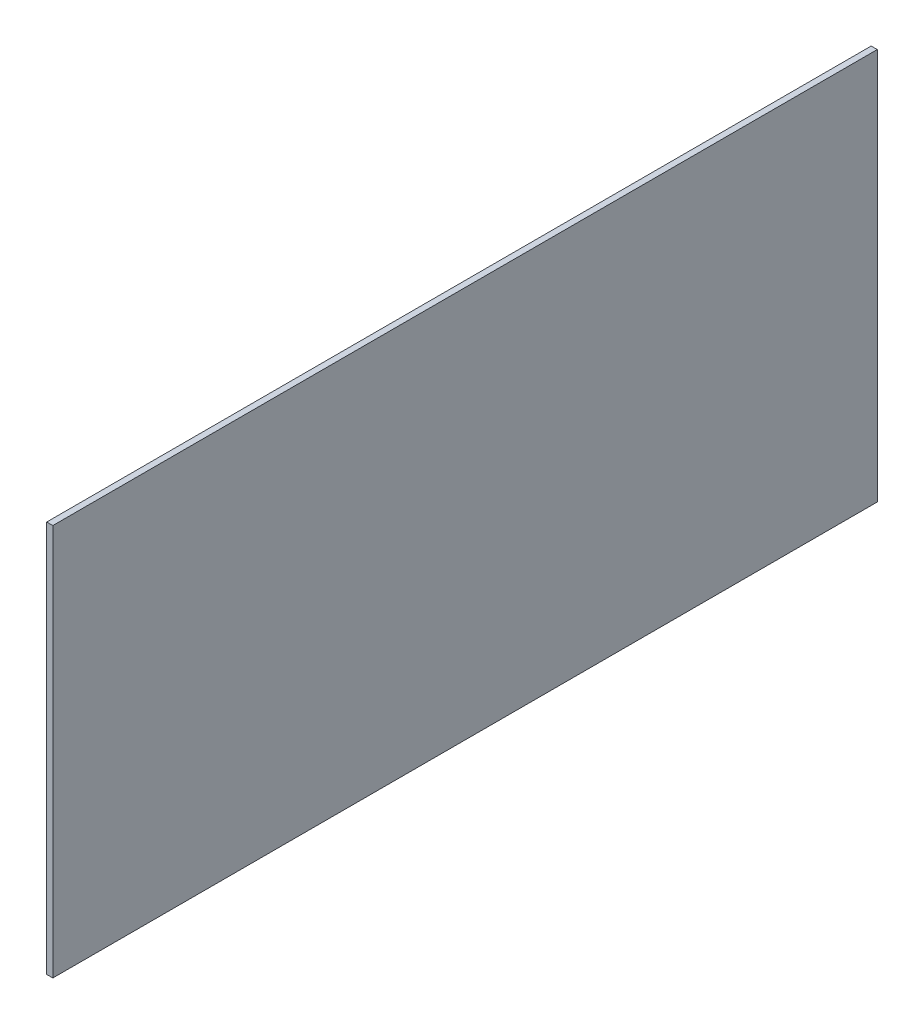
ISO-10303-21;
HEADER;
FILE_DESCRIPTION(('STEP AP214'),'2;1');
FILE_NAME('part.step','',(''),(''),'','','');
FILE_SCHEMA(('AUTOMOTIVE_DESIGN { 1 0 10303 214 1 1 1 1 }'));
ENDSEC;
DATA;
#1=APPLICATION_CONTEXT('core data for automotive mechanical design processes');
#2=APPLICATION_PROTOCOL_DEFINITION('international standard','automotive_design',2000,#1);
#3=PRODUCT_CONTEXT('',#1,'mechanical');
#4=PRODUCT('Part','Part','',(#3));
#5=PRODUCT_RELATED_PRODUCT_CATEGORY('part','',(#4));
#6=PRODUCT_DEFINITION_FORMATION('','',#4);
#7=PRODUCT_DEFINITION_CONTEXT('part definition',#1,'design');
#8=PRODUCT_DEFINITION('design','',#6,#7);
#9=PRODUCT_DEFINITION_SHAPE('','',#8);
#10=(LENGTH_UNIT() NAMED_UNIT(*) SI_UNIT(.MILLI.,.METRE.));
#11=(NAMED_UNIT(*) PLANE_ANGLE_UNIT() SI_UNIT($,.RADIAN.));
#12=(NAMED_UNIT(*) SI_UNIT($,.STERADIAN.) SOLID_ANGLE_UNIT());
#13=UNCERTAINTY_MEASURE_WITH_UNIT(LENGTH_MEASURE(1.E-05),#10,'distance_accuracy_value','');
#14=(GEOMETRIC_REPRESENTATION_CONTEXT(3) GLOBAL_UNCERTAINTY_ASSIGNED_CONTEXT((#13)) GLOBAL_UNIT_ASSIGNED_CONTEXT((#10,
#11,#12)) REPRESENTATION_CONTEXT('',''));
#15=CARTESIAN_POINT('',(0.,0.,0.));
#16=DIRECTION('',(0.,0.,1.));
#17=DIRECTION('',(1.,0.,0.));
#18=AXIS2_PLACEMENT_3D('',#15,#16,#17);
#19=CARTESIAN_POINT('',(331.999992370655,167.000000000035,156.904000000003));
#20=DIRECTION('',(1.,0.,0.));
#21=DIRECTION('',(0.,1.,0.));
#22=AXIS2_PLACEMENT_3D('',#19,#20,#21);
#23=PLANE('',#22);
#24=DIRECTION('',(0.,-1.,0.));
#25=VECTOR('',#24,1.);
#26=CARTESIAN_POINT('',(331.999992370655,359.000000000074,-45.0959999999973));
#27=LINE('',#26,#25);
#28=CARTESIAN_POINT('',(331.999992370655,167.000000000035,-45.0959999999973));
#29=VERTEX_POINT('',#28);
#30=CARTESIAN_POINT('',(331.999992370655,-25.0000000000038,-45.0959999999973));
#31=VERTEX_POINT('',#30);
#32=EDGE_CURVE('E28',#29,#31,#27,.T.);
#33=ORIENTED_EDGE('',*,*,#32,.T.);
#34=DIRECTION('',(0.,0.,1.));
#35=VECTOR('',#34,1.);
#36=CARTESIAN_POINT('',(331.999992370655,-25.0000000000038,-45.0959999999973));
#37=LINE('',#36,#35);
#38=CARTESIAN_POINT('',(331.999992370655,-25.0000000000038,358.904));
#39=VERTEX_POINT('',#38);
#40=EDGE_CURVE('E90',#31,#39,#37,.T.);
#41=ORIENTED_EDGE('',*,*,#40,.T.);
#42=DIRECTION('',(0.,1.,0.));
#43=VECTOR('',#42,1.);
#44=CARTESIAN_POINT('',(331.999992370655,-25.0000000000038,358.904));
#45=LINE('',#44,#43);
#46=CARTESIAN_POINT('',(331.999992370655,167.000000000035,358.904));
#47=VERTEX_POINT('',#46);
#48=EDGE_CURVE('E72',#39,#47,#45,.T.);
#49=ORIENTED_EDGE('',*,*,#48,.T.);
#50=DIRECTION('',(0.,0.,-1.));
#51=VECTOR('',#50,1.);
#52=CARTESIAN_POINT('',(331.999992370655,167.000000000035,358.904));
#53=LINE('',#52,#51);
#54=EDGE_CURVE('E104',#47,#29,#53,.T.);
#55=ORIENTED_EDGE('',*,*,#54,.T.);
#56=EDGE_LOOP('',(#33,#41,#49,#55));
#57=FACE_BOUND('',#56,.T.);
#58=ADVANCED_FACE('F17',(#57),#23,.F.);
#59=CARTESIAN_POINT('',(334.999992370655,167.000000000035,156.904000000003));
#60=DIRECTION('',(1.,0.,0.));
#61=DIRECTION('',(0.,1.,0.));
#62=AXIS2_PLACEMENT_3D('',#59,#60,#61);
#63=PLANE('',#62);
#64=DIRECTION('',(0.,1.,0.));
#65=VECTOR('',#64,1.);
#66=CARTESIAN_POINT('',(334.999992370655,359.000000000074,-45.0959999999973));
#67=LINE('',#66,#65);
#68=CARTESIAN_POINT('',(334.999992370655,-25.0000000000038,-45.0959999999973));
#69=VERTEX_POINT('',#68);
#70=CARTESIAN_POINT('',(334.999992370655,167.000000000035,-45.0959999999973));
#71=VERTEX_POINT('',#70);
#72=EDGE_CURVE('E11',#69,#71,#67,.T.);
#73=ORIENTED_EDGE('',*,*,#72,.T.);
#74=DIRECTION('',(0.,0.,1.));
#75=VECTOR('',#74,1.);
#76=CARTESIAN_POINT('',(334.999992370655,167.000000000035,358.904));
#77=LINE('',#76,#75);
#78=CARTESIAN_POINT('',(334.999992370655,167.000000000035,358.904));
#79=VERTEX_POINT('',#78);
#80=EDGE_CURVE('E109',#71,#79,#77,.T.);
#81=ORIENTED_EDGE('',*,*,#80,.T.);
#82=DIRECTION('',(0.,-1.,0.));
#83=VECTOR('',#82,1.);
#84=CARTESIAN_POINT('',(334.999992370655,-25.0000000000038,358.904));
#85=LINE('',#84,#83);
#86=CARTESIAN_POINT('',(334.999992370655,-25.0000000000038,358.904));
#87=VERTEX_POINT('',#86);
#88=EDGE_CURVE('E84',#79,#87,#85,.T.);
#89=ORIENTED_EDGE('',*,*,#88,.T.);
#90=DIRECTION('',(0.,0.,-1.));
#91=VECTOR('',#90,1.);
#92=CARTESIAN_POINT('',(334.999992370655,-25.0000000000038,-45.0959999999973));
#93=LINE('',#92,#91);
#94=EDGE_CURVE('E91',#87,#69,#93,.T.);
#95=ORIENTED_EDGE('',*,*,#94,.T.);
#96=EDGE_LOOP('',(#73,#81,#89,#95));
#97=FACE_BOUND('',#96,.T.);
#98=ADVANCED_FACE('F128',(#97),#63,.T.);
#99=CARTESIAN_POINT('',(331.999992370655,-25.0000000000038,-45.0959999999973));
#100=DIRECTION('',(0.,0.,-1.));
#101=DIRECTION('',(0.,-1.,0.));
#102=AXIS2_PLACEMENT_3D('',#99,#100,#101);
#103=PLANE('',#102);
#104=ORIENTED_EDGE('',*,*,#32,.F.);
#105=DIRECTION('',(1.,0.,0.));
#106=VECTOR('',#105,1.);
#107=CARTESIAN_POINT('',(331.999992370655,167.000000000035,-45.0959999999973));
#108=LINE('',#107,#106);
#109=EDGE_CURVE('E21',#29,#71,#108,.T.);
#110=ORIENTED_EDGE('',*,*,#109,.T.);
#111=ORIENTED_EDGE('',*,*,#72,.F.);
#112=DIRECTION('',(1.,0.,0.));
#113=VECTOR('',#112,1.);
#114=CARTESIAN_POINT('',(331.999992370655,-25.0000000000038,-45.0959999999973));
#115=LINE('',#114,#113);
#116=EDGE_CURVE('E95',#31,#69,#115,.T.);
#117=ORIENTED_EDGE('',*,*,#116,.F.);
#118=EDGE_LOOP('',(#104,#110,#111,#117));
#119=FACE_BOUND('',#118,.T.);
#120=ADVANCED_FACE('F120',(#119),#103,.T.);
#121=CARTESIAN_POINT('',(331.999992370655,167.000000000035,-45.0959999999973));
#122=DIRECTION('',(0.,1.,0.));
#123=DIRECTION('',(0.,0.,-1.));
#124=AXIS2_PLACEMENT_3D('',#121,#122,#123);
#125=PLANE('',#124);
#126=ORIENTED_EDGE('',*,*,#54,.F.);
#127=DIRECTION('',(1.,0.,0.));
#128=VECTOR('',#127,1.);
#129=CARTESIAN_POINT('',(331.999992370655,167.000000000035,358.904));
#130=LINE('',#129,#128);
#131=EDGE_CURVE('E79',#47,#79,#130,.T.);
#132=ORIENTED_EDGE('',*,*,#131,.T.);
#133=ORIENTED_EDGE('',*,*,#80,.F.);
#134=ORIENTED_EDGE('',*,*,#109,.F.);
#135=EDGE_LOOP('',(#126,#132,#133,#134));
#136=FACE_BOUND('',#135,.T.);
#137=ADVANCED_FACE('F19',(#136),#125,.T.);
#138=CARTESIAN_POINT('',(331.999992370655,167.000000000035,358.904));
#139=DIRECTION('',(0.,0.,1.));
#140=DIRECTION('',(0.,-1.,0.));
#141=AXIS2_PLACEMENT_3D('',#138,#139,#140);
#142=PLANE('',#141);
#143=ORIENTED_EDGE('',*,*,#48,.F.);
#144=DIRECTION('',(1.,0.,0.));
#145=VECTOR('',#144,1.);
#146=CARTESIAN_POINT('',(331.999992370655,-25.0000000000038,358.904));
#147=LINE('',#146,#145);
#148=EDGE_CURVE('E76',#39,#87,#147,.T.);
#149=ORIENTED_EDGE('',*,*,#148,.T.);
#150=ORIENTED_EDGE('',*,*,#88,.F.);
#151=ORIENTED_EDGE('',*,*,#131,.F.);
#152=EDGE_LOOP('',(#143,#149,#150,#151));
#153=FACE_BOUND('',#152,.T.);
#154=ADVANCED_FACE('F74',(#153),#142,.T.);
#155=CARTESIAN_POINT('',(331.999992370655,-25.0000000000038,358.904));
#156=DIRECTION('',(0.,-1.,0.));
#157=DIRECTION('',(-1.,0.,0.));
#158=AXIS2_PLACEMENT_3D('',#155,#156,#157);
#159=PLANE('',#158);
#160=ORIENTED_EDGE('',*,*,#40,.F.);
#161=ORIENTED_EDGE('',*,*,#116,.T.);
#162=ORIENTED_EDGE('',*,*,#94,.F.);
#163=ORIENTED_EDGE('',*,*,#148,.F.);
#164=EDGE_LOOP('',(#160,#161,#162,#163));
#165=FACE_BOUND('',#164,.T.);
#166=ADVANCED_FACE('F88',(#165),#159,.T.);
#167=CLOSED_SHELL('',(#58,#98,#120,#137,#154,#166));
#168=MANIFOLD_SOLID_BREP('B1',#167);
#169=ADVANCED_BREP_SHAPE_REPRESENTATION('',(#18,#168),#14);
#170=SHAPE_DEFINITION_REPRESENTATION(#9,#169);
ENDSEC;
END-ISO-10303-21;
